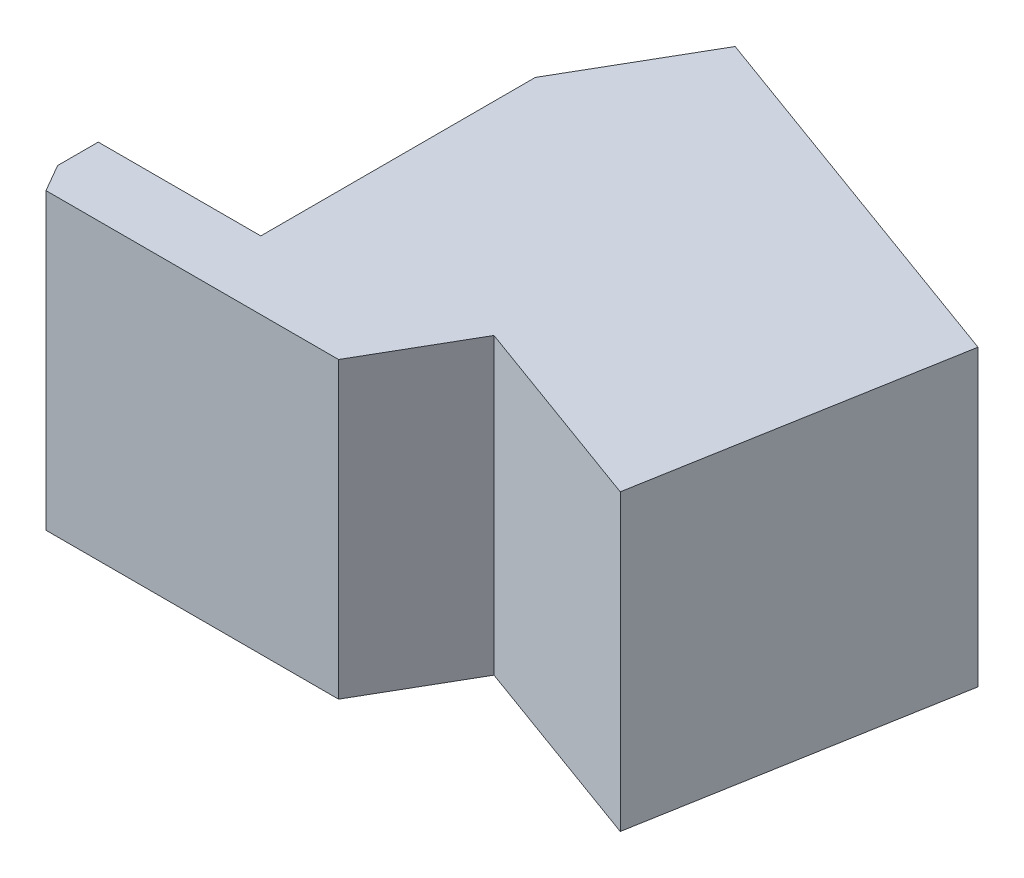
ISO-10303-21;
HEADER;
FILE_DESCRIPTION(('STEP AP214'),'2;1');
FILE_NAME('part.step','',(''),(''),'','','');
FILE_SCHEMA(('AUTOMOTIVE_DESIGN { 1 0 10303 214 1 1 1 1 }'));
ENDSEC;
DATA;
#1=APPLICATION_CONTEXT('core data for automotive mechanical design processes');
#2=APPLICATION_PROTOCOL_DEFINITION('international standard','automotive_design',2000,#1);
#3=PRODUCT_CONTEXT('',#1,'mechanical');
#4=PRODUCT('Part','Part','',(#3));
#5=PRODUCT_RELATED_PRODUCT_CATEGORY('part','',(#4));
#6=PRODUCT_DEFINITION_FORMATION('','',#4);
#7=PRODUCT_DEFINITION_CONTEXT('part definition',#1,'design');
#8=PRODUCT_DEFINITION('design','',#6,#7);
#9=PRODUCT_DEFINITION_SHAPE('','',#8);
#10=(LENGTH_UNIT() NAMED_UNIT(*) SI_UNIT(.MILLI.,.METRE.));
#11=(NAMED_UNIT(*) PLANE_ANGLE_UNIT() SI_UNIT($,.RADIAN.));
#12=(NAMED_UNIT(*) SI_UNIT($,.STERADIAN.) SOLID_ANGLE_UNIT());
#13=UNCERTAINTY_MEASURE_WITH_UNIT(LENGTH_MEASURE(1.E-05),#10,'distance_accuracy_value','');
#14=(GEOMETRIC_REPRESENTATION_CONTEXT(3) GLOBAL_UNCERTAINTY_ASSIGNED_CONTEXT((#13)) GLOBAL_UNIT_ASSIGNED_CONTEXT((#10,
#11,#12)) REPRESENTATION_CONTEXT('',''));
#15=CARTESIAN_POINT('',(0.,0.,0.));
#16=DIRECTION('',(0.,0.,1.));
#17=DIRECTION('',(1.,0.,0.));
#18=AXIS2_PLACEMENT_3D('',#15,#16,#17);
#19=CARTESIAN_POINT('',(-185.,90.5,20.));
#20=DIRECTION('',(1.,0.,0.));
#21=DIRECTION('',(0.,0.,-1.));
#22=AXIS2_PLACEMENT_3D('',#19,#20,#21);
#23=PLANE('',#22);
#24=DIRECTION('',(0.,0.,1.));
#25=VECTOR('',#24,1.);
#26=CARTESIAN_POINT('',(-185.,-90.5,20.));
#27=LINE('',#26,#25);
#28=CARTESIAN_POINT('',(-185.,-90.5,20.));
#29=VERTEX_POINT('',#28);
#30=CARTESIAN_POINT('',(-185.,-90.5,45.));
#31=VERTEX_POINT('',#30);
#32=EDGE_CURVE('E147',#29,#31,#27,.T.);
#33=ORIENTED_EDGE('',*,*,#32,.T.);
#34=DIRECTION('',(0.,-1.,0.));
#35=VECTOR('',#34,1.);
#36=CARTESIAN_POINT('',(-185.,90.5,45.));
#37=LINE('',#36,#35);
#38=CARTESIAN_POINT('',(-185.,90.5,45.));
#39=VERTEX_POINT('',#38);
#40=EDGE_CURVE('E11',#39,#31,#37,.T.);
#41=ORIENTED_EDGE('',*,*,#40,.F.);
#42=DIRECTION('',(0.,0.,1.));
#43=VECTOR('',#42,1.);
#44=CARTESIAN_POINT('',(-185.,90.5,20.));
#45=LINE('',#44,#43);
#46=CARTESIAN_POINT('',(-185.,90.5,20.));
#47=VERTEX_POINT('',#46);
#48=EDGE_CURVE('E165',#47,#39,#45,.T.);
#49=ORIENTED_EDGE('',*,*,#48,.F.);
#50=DIRECTION('',(0.,-1.,0.));
#51=VECTOR('',#50,1.);
#52=CARTESIAN_POINT('',(-185.,90.5,20.));
#53=LINE('',#52,#51);
#54=EDGE_CURVE('E143',#47,#29,#53,.T.);
#55=ORIENTED_EDGE('',*,*,#54,.T.);
#56=EDGE_LOOP('',(#33,#41,#49,#55));
#57=FACE_BOUND('',#56,.T.);
#58=ADVANCED_FACE('F39',(#57),#23,.F.);
#59=CARTESIAN_POINT('',(-185.,90.5,45.));
#60=DIRECTION('',(0.866025403784442,0.,-0.499999999999995));
#61=DIRECTION('',(-0.499999999999995,0.,-0.866025403784442));
#62=AXIS2_PLACEMENT_3D('',#59,#60,#61);
#63=PLANE('',#62);
#64=DIRECTION('',(0.499999999999995,0.,0.866025403784442));
#65=VECTOR('',#64,1.);
#66=CARTESIAN_POINT('',(-185.,-90.5,45.));
#67=LINE('',#66,#65);
#68=CARTESIAN_POINT('',(-175.230039262409,-90.5,61.9220683854611));
#69=VERTEX_POINT('',#68);
#70=EDGE_CURVE('E150',#31,#69,#67,.T.);
#71=ORIENTED_EDGE('',*,*,#70,.T.);
#72=DIRECTION('',(0.,-1.,0.));
#73=VECTOR('',#72,1.);
#74=CARTESIAN_POINT('',(-175.230039262409,90.5,61.9220683854611));
#75=LINE('',#74,#73);
#76=CARTESIAN_POINT('',(-175.230039262409,90.5,61.9220683854611));
#77=VERTEX_POINT('',#76);
#78=EDGE_CURVE('E47',#77,#69,#75,.T.);
#79=ORIENTED_EDGE('',*,*,#78,.F.);
#80=DIRECTION('',(0.499999999999995,0.,0.866025403784442));
#81=VECTOR('',#80,1.);
#82=CARTESIAN_POINT('',(-185.,90.5,45.));
#83=LINE('',#82,#81);
#84=EDGE_CURVE('E104',#39,#77,#83,.T.);
#85=ORIENTED_EDGE('',*,*,#84,.F.);
#86=ORIENTED_EDGE('',*,*,#40,.T.);
#87=EDGE_LOOP('',(#71,#79,#85,#86));
#88=FACE_BOUND('',#87,.T.);
#89=ADVANCED_FACE('F214',(#88),#63,.F.);
#90=CARTESIAN_POINT('',(-175.230039262409,90.5,61.9220683854611));
#91=DIRECTION('',(0.,0.,-1.));
#92=DIRECTION('',(-1.,0.,0.));
#93=AXIS2_PLACEMENT_3D('',#90,#91,#92);
#94=PLANE('',#93);
#95=DIRECTION('',(1.,0.,0.));
#96=VECTOR('',#95,1.);
#97=CARTESIAN_POINT('',(-175.230039262409,-90.5,61.9220683854611));
#98=LINE('',#97,#96);
#99=CARTESIAN_POINT('',(4.76996073759098,-90.5,61.9220683854611));
#100=VERTEX_POINT('',#99);
#101=EDGE_CURVE('E152',#69,#100,#98,.T.);
#102=ORIENTED_EDGE('',*,*,#101,.T.);
#103=DIRECTION('',(0.,-1.,0.));
#104=VECTOR('',#103,1.);
#105=CARTESIAN_POINT('',(4.76996073759098,90.5,61.9220683854611));
#106=LINE('',#105,#104);
#107=CARTESIAN_POINT('',(4.76996073759098,90.5,61.9220683854611));
#108=VERTEX_POINT('',#107);
#109=EDGE_CURVE('E178',#108,#100,#106,.T.);
#110=ORIENTED_EDGE('',*,*,#109,.F.);
#111=DIRECTION('',(1.,0.,0.));
#112=VECTOR('',#111,1.);
#113=CARTESIAN_POINT('',(-175.230039262409,90.5,61.9220683854611));
#114=LINE('',#113,#112);
#115=EDGE_CURVE('E186',#77,#108,#114,.T.);
#116=ORIENTED_EDGE('',*,*,#115,.F.);
#117=ORIENTED_EDGE('',*,*,#78,.T.);
#118=EDGE_LOOP('',(#102,#110,#116,#117));
#119=FACE_BOUND('',#118,.T.);
#120=ADVANCED_FACE('F184',(#119),#94,.F.);
#121=CARTESIAN_POINT('',(4.76996073759098,90.5,61.9220683854611));
#122=DIRECTION('',(-0.866025403784441,0.,-0.499999999999995));
#123=DIRECTION('',(-0.499999999999995,0.,0.866025403784441));
#124=AXIS2_PLACEMENT_3D('',#121,#122,#123);
#125=PLANE('',#124);
#126=DIRECTION('',(0.499999999999995,0.,-0.866025403784441));
#127=VECTOR('',#126,1.);
#128=CARTESIAN_POINT('',(4.76996073759098,-90.5,61.9220683854611));
#129=LINE('',#128,#127);
#130=CARTESIAN_POINT('',(39.7699607375907,-90.5,1.30029012055023));
#131=VERTEX_POINT('',#130);
#132=EDGE_CURVE('E154',#100,#131,#129,.T.);
#133=ORIENTED_EDGE('',*,*,#132,.T.);
#134=DIRECTION('',(0.,-1.,0.));
#135=VECTOR('',#134,1.);
#136=CARTESIAN_POINT('',(39.7699607375907,90.5,1.30029012055023));
#137=LINE('',#136,#135);
#138=CARTESIAN_POINT('',(39.7699607375907,90.5,1.30029012055023));
#139=VERTEX_POINT('',#138);
#140=EDGE_CURVE('E175',#139,#131,#137,.T.);
#141=ORIENTED_EDGE('',*,*,#140,.F.);
#142=DIRECTION('',(0.499999999999995,0.,-0.866025403784441));
#143=VECTOR('',#142,1.);
#144=CARTESIAN_POINT('',(4.76996073759098,90.5,61.9220683854611));
#145=LINE('',#144,#143);
#146=EDGE_CURVE('E204',#108,#139,#145,.T.);
#147=ORIENTED_EDGE('',*,*,#146,.F.);
#148=ORIENTED_EDGE('',*,*,#109,.T.);
#149=EDGE_LOOP('',(#133,#141,#147,#148));
#150=FACE_BOUND('',#149,.T.);
#151=ADVANCED_FACE('F195',(#150),#125,.F.);
#152=CARTESIAN_POINT('',(39.7699607375907,90.5,1.30029012055023));
#153=DIRECTION('',(0.342020143325681,0.,-0.939692620785904));
#154=DIRECTION('',(-0.939692620785904,0.,-0.342020143325681));
#155=AXIS2_PLACEMENT_3D('',#152,#153,#154);
#156=PLANE('',#155);
#157=DIRECTION('',(0.939692620785904,0.,0.342020143325681));
#158=VECTOR('',#157,1.);
#159=CARTESIAN_POINT('',(39.7699607375907,-90.5,1.30029012055023));
#160=LINE('',#159,#158);
#161=CARTESIAN_POINT('',(161.930001439758,-90.5,45.7629087528888));
#162=VERTEX_POINT('',#161);
#163=EDGE_CURVE('E156',#131,#162,#160,.T.);
#164=ORIENTED_EDGE('',*,*,#163,.T.);
#165=DIRECTION('',(0.,-1.,0.));
#166=VECTOR('',#165,1.);
#167=CARTESIAN_POINT('',(161.930001439758,90.5,45.7629087528888));
#168=LINE('',#167,#166);
#169=CARTESIAN_POINT('',(161.930001439758,90.5,45.7629087528888));
#170=VERTEX_POINT('',#169);
#171=EDGE_CURVE('E172',#170,#162,#168,.T.);
#172=ORIENTED_EDGE('',*,*,#171,.F.);
#173=DIRECTION('',(0.939692620785904,0.,0.342020143325681));
#174=VECTOR('',#173,1.);
#175=CARTESIAN_POINT('',(39.7699607375907,90.5,1.30029012055023));
#176=LINE('',#175,#174);
#177=EDGE_CURVE('E201',#139,#170,#176,.T.);
#178=ORIENTED_EDGE('',*,*,#177,.F.);
#179=ORIENTED_EDGE('',*,*,#140,.T.);
#180=EDGE_LOOP('',(#164,#172,#178,#179));
#181=FACE_BOUND('',#180,.T.);
#182=ADVANCED_FACE('F199',(#181),#156,.F.);
#183=CARTESIAN_POINT('',(161.930001439758,90.5,45.7629087528888));
#184=DIRECTION('',(-0.984807753012206,0.,-0.173648177666939));
#185=DIRECTION('',(-0.173648177666939,0.,0.984807753012207));
#186=AXIS2_PLACEMENT_3D('',#183,#184,#185);
#187=PLANE('',#186);
#188=DIRECTION('',(0.173648177666939,0.,-0.984807753012207));
#189=VECTOR('',#188,1.);
#190=CARTESIAN_POINT('',(161.930001439758,-90.5,45.7629087528888));
#191=LINE('',#190,#189);
#192=CARTESIAN_POINT('',(194.923155196477,-90.5,-141.35056431943));
#193=VERTEX_POINT('',#192);
#194=EDGE_CURVE('E158',#162,#193,#191,.T.);
#195=ORIENTED_EDGE('',*,*,#194,.T.);
#196=DIRECTION('',(0.,-1.,0.));
#197=VECTOR('',#196,1.);
#198=CARTESIAN_POINT('',(194.923155196477,90.5,-141.35056431943));
#199=LINE('',#198,#197);
#200=CARTESIAN_POINT('',(194.923155196477,90.5,-141.35056431943));
#201=VERTEX_POINT('',#200);
#202=EDGE_CURVE('E169',#201,#193,#199,.T.);
#203=ORIENTED_EDGE('',*,*,#202,.F.);
#204=DIRECTION('',(0.173648177666939,0.,-0.984807753012207));
#205=VECTOR('',#204,1.);
#206=CARTESIAN_POINT('',(161.930001439758,90.5,45.7629087528888));
#207=LINE('',#206,#205);
#208=EDGE_CURVE('E203',#170,#201,#207,.T.);
#209=ORIENTED_EDGE('',*,*,#208,.F.);
#210=ORIENTED_EDGE('',*,*,#171,.T.);
#211=EDGE_LOOP('',(#195,#203,#209,#210));
#212=FACE_BOUND('',#211,.T.);
#213=ADVANCED_FACE('F226',(#212),#187,.F.);
#214=CARTESIAN_POINT('',(194.923155196477,90.5,-141.35056431943));
#215=DIRECTION('',(-0.342020143325673,0.,0.939692620785907));
#216=DIRECTION('',(0.939692620785907,0.,0.342020143325673));
#217=AXIS2_PLACEMENT_3D('',#214,#215,#216);
#218=PLANE('',#217);
#219=DIRECTION('',(-0.939692620785907,0.,-0.342020143325674));
#220=VECTOR('',#219,1.);
#221=CARTESIAN_POINT('',(194.923155196477,-90.5,-141.35056431943));
#222=LINE('',#221,#220);
#223=CARTESIAN_POINT('',(-40.,-90.5,-226.855600150849));
#224=VERTEX_POINT('',#223);
#225=EDGE_CURVE('E160',#193,#224,#222,.T.);
#226=ORIENTED_EDGE('',*,*,#225,.T.);
#227=DIRECTION('',(0.,-1.,0.));
#228=VECTOR('',#227,1.);
#229=CARTESIAN_POINT('',(-40.,90.5,-226.855600150849));
#230=LINE('',#229,#228);
#231=CARTESIAN_POINT('',(-40.,90.5,-226.855600150849));
#232=VERTEX_POINT('',#231);
#233=EDGE_CURVE('E138',#232,#224,#230,.T.);
#234=ORIENTED_EDGE('',*,*,#233,.F.);
#235=DIRECTION('',(-0.939692620785907,0.,-0.342020143325674));
#236=VECTOR('',#235,1.);
#237=CARTESIAN_POINT('',(194.923155196477,90.5,-141.35056431943));
#238=LINE('',#237,#236);
#239=EDGE_CURVE('E129',#201,#232,#238,.T.);
#240=ORIENTED_EDGE('',*,*,#239,.F.);
#241=ORIENTED_EDGE('',*,*,#202,.T.);
#242=EDGE_LOOP('',(#226,#234,#240,#241));
#243=FACE_BOUND('',#242,.T.);
#244=ADVANCED_FACE('F229',(#243),#218,.F.);
#245=CARTESIAN_POINT('',(-40.,90.5,-226.855600150849));
#246=DIRECTION('',(0.866025403784438,0.,0.500000000000002));
#247=DIRECTION('',(0.500000000000002,0.,-0.866025403784438));
#248=AXIS2_PLACEMENT_3D('',#245,#246,#247);
#249=PLANE('',#248);
#250=DIRECTION('',(-0.500000000000002,0.,0.866025403784438));
#251=VECTOR('',#250,1.);
#252=CARTESIAN_POINT('',(-40.,-90.5,-226.855600150849));
#253=LINE('',#252,#251);
#254=CARTESIAN_POINT('',(-85.0000000000002,-90.5,-148.913313810249));
#255=VERTEX_POINT('',#254);
#256=EDGE_CURVE('E137',#224,#255,#253,.T.);
#257=ORIENTED_EDGE('',*,*,#256,.T.);
#258=DIRECTION('',(0.,-1.,0.));
#259=VECTOR('',#258,1.);
#260=CARTESIAN_POINT('',(-85.0000000000002,90.5,-148.913313810249));
#261=LINE('',#260,#259);
#262=CARTESIAN_POINT('',(-85.0000000000002,90.5,-148.913313810249));
#263=VERTEX_POINT('',#262);
#264=EDGE_CURVE('E134',#263,#255,#261,.T.);
#265=ORIENTED_EDGE('',*,*,#264,.F.);
#266=DIRECTION('',(-0.500000000000002,0.,0.866025403784438));
#267=VECTOR('',#266,1.);
#268=CARTESIAN_POINT('',(-40.,90.5,-226.855600150849));
#269=LINE('',#268,#267);
#270=EDGE_CURVE('E123',#232,#263,#269,.T.);
#271=ORIENTED_EDGE('',*,*,#270,.F.);
#272=ORIENTED_EDGE('',*,*,#233,.T.);
#273=EDGE_LOOP('',(#257,#265,#271,#272));
#274=FACE_BOUND('',#273,.T.);
#275=ADVANCED_FACE('F135',(#274),#249,.F.);
#276=CARTESIAN_POINT('',(-85.0000000000002,90.5,-148.913313810249));
#277=DIRECTION('',(1.,0.,0.));
#278=DIRECTION('',(0.,0.,-1.));
#279=AXIS2_PLACEMENT_3D('',#276,#277,#278);
#280=PLANE('',#279);
#281=DIRECTION('',(0.,0.,1.));
#282=VECTOR('',#281,1.);
#283=CARTESIAN_POINT('',(-85.0000000000002,-90.5,-148.913313810249));
#284=LINE('',#283,#282);
#285=CARTESIAN_POINT('',(-85.0000000000001,-90.5,20.));
#286=VERTEX_POINT('',#285);
#287=EDGE_CURVE('E90',#255,#286,#284,.T.);
#288=ORIENTED_EDGE('',*,*,#287,.T.);
#289=DIRECTION('',(0.,-1.,0.));
#290=VECTOR('',#289,1.);
#291=CARTESIAN_POINT('',(-85.0000000000001,90.5,20.));
#292=LINE('',#291,#290);
#293=CARTESIAN_POINT('',(-85.0000000000001,90.5,20.));
#294=VERTEX_POINT('',#293);
#295=EDGE_CURVE('E139',#294,#286,#292,.T.);
#296=ORIENTED_EDGE('',*,*,#295,.F.);
#297=DIRECTION('',(0.,0.,1.));
#298=VECTOR('',#297,1.);
#299=CARTESIAN_POINT('',(-85.0000000000002,90.5,-148.913313810249));
#300=LINE('',#299,#298);
#301=EDGE_CURVE('E127',#263,#294,#300,.T.);
#302=ORIENTED_EDGE('',*,*,#301,.F.);
#303=ORIENTED_EDGE('',*,*,#264,.T.);
#304=EDGE_LOOP('',(#288,#296,#302,#303));
#305=FACE_BOUND('',#304,.T.);
#306=ADVANCED_FACE('F141',(#305),#280,.F.);
#307=CARTESIAN_POINT('',(-85.0000000000001,90.5,20.));
#308=DIRECTION('',(0.,0.,1.));
#309=DIRECTION('',(1.,0.,0.));
#310=AXIS2_PLACEMENT_3D('',#307,#308,#309);
#311=PLANE('',#310);
#312=DIRECTION('',(-1.,0.,0.));
#313=VECTOR('',#312,1.);
#314=CARTESIAN_POINT('',(-85.0000000000001,-90.5,20.));
#315=LINE('',#314,#313);
#316=EDGE_CURVE('E96',#286,#29,#315,.T.);
#317=ORIENTED_EDGE('',*,*,#316,.T.);
#318=ORIENTED_EDGE('',*,*,#54,.F.);
#319=DIRECTION('',(-1.,0.,0.));
#320=VECTOR('',#319,1.);
#321=CARTESIAN_POINT('',(-85.0000000000001,90.5,20.));
#322=LINE('',#321,#320);
#323=EDGE_CURVE('E55',#294,#47,#322,.T.);
#324=ORIENTED_EDGE('',*,*,#323,.F.);
#325=ORIENTED_EDGE('',*,*,#295,.T.);
#326=EDGE_LOOP('',(#317,#318,#324,#325));
#327=FACE_BOUND('',#326,.T.);
#328=ADVANCED_FACE('F238',(#327),#311,.F.);
#329=CARTESIAN_POINT('',(0.,90.5,0.));
#330=DIRECTION('',(0.,1.,0.));
#331=DIRECTION('',(0.,0.,1.));
#332=AXIS2_PLACEMENT_3D('',#329,#330,#331);
#333=PLANE('',#332);
#334=ORIENTED_EDGE('',*,*,#48,.T.);
#335=ORIENTED_EDGE('',*,*,#84,.T.);
#336=ORIENTED_EDGE('',*,*,#115,.T.);
#337=ORIENTED_EDGE('',*,*,#146,.T.);
#338=ORIENTED_EDGE('',*,*,#177,.T.);
#339=ORIENTED_EDGE('',*,*,#208,.T.);
#340=ORIENTED_EDGE('',*,*,#239,.T.);
#341=ORIENTED_EDGE('',*,*,#270,.T.);
#342=ORIENTED_EDGE('',*,*,#301,.T.);
#343=ORIENTED_EDGE('',*,*,#323,.T.);
#344=EDGE_LOOP('',(#334,#335,#336,#337,#338,#339,#340,#341,#342,#343));
#345=FACE_BOUND('',#344,.T.);
#346=ADVANCED_FACE('F125',(#345),#333,.T.);
#347=CARTESIAN_POINT('',(0.,-90.5,0.));
#348=DIRECTION('',(0.,1.,0.));
#349=DIRECTION('',(0.,0.,1.));
#350=AXIS2_PLACEMENT_3D('',#347,#348,#349);
#351=PLANE('',#350);
#352=ORIENTED_EDGE('',*,*,#32,.F.);
#353=ORIENTED_EDGE('',*,*,#316,.F.);
#354=ORIENTED_EDGE('',*,*,#287,.F.);
#355=ORIENTED_EDGE('',*,*,#256,.F.);
#356=ORIENTED_EDGE('',*,*,#225,.F.);
#357=ORIENTED_EDGE('',*,*,#194,.F.);
#358=ORIENTED_EDGE('',*,*,#163,.F.);
#359=ORIENTED_EDGE('',*,*,#132,.F.);
#360=ORIENTED_EDGE('',*,*,#101,.F.);
#361=ORIENTED_EDGE('',*,*,#70,.F.);
#362=EDGE_LOOP('',(#352,#353,#354,#355,#356,#357,#358,#359,#360,#361));
#363=FACE_BOUND('',#362,.T.);
#364=ADVANCED_FACE('F190',(#363),#351,.F.);
#365=CLOSED_SHELL('',(#58,#89,#120,#151,#182,#213,#244,#275,#306,#328,#346,#364));
#366=MANIFOLD_SOLID_BREP('B2',#365);
#367=ADVANCED_BREP_SHAPE_REPRESENTATION('',(#18,#366),#14);
#368=SHAPE_DEFINITION_REPRESENTATION(#9,#367);
ENDSEC;
END-ISO-10303-21;
